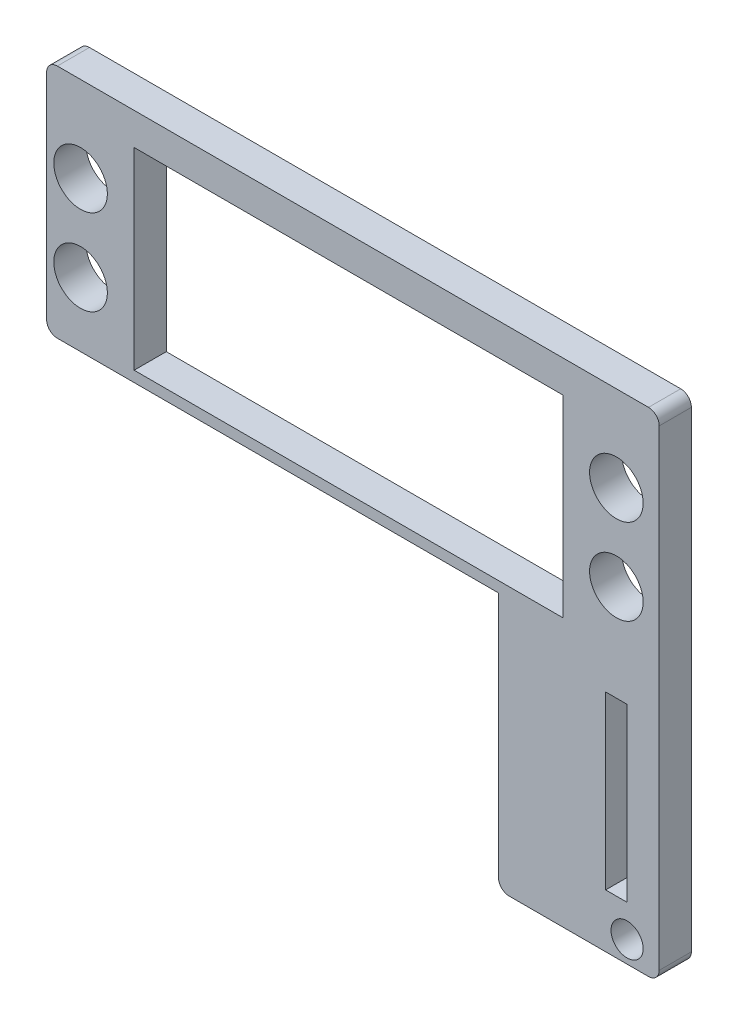
ISO-10303-21;
HEADER;
FILE_DESCRIPTION(('STEP AP214'),'2;1');
FILE_NAME('part.step','',(''),(''),'','','');
FILE_SCHEMA(('AUTOMOTIVE_DESIGN { 1 0 10303 214 1 1 1 1 }'));
ENDSEC;
DATA;
#1=APPLICATION_CONTEXT('core data for automotive mechanical design processes');
#2=APPLICATION_PROTOCOL_DEFINITION('international standard','automotive_design',2000,#1);
#3=PRODUCT_CONTEXT('',#1,'mechanical');
#4=PRODUCT('Part','Part','',(#3));
#5=PRODUCT_RELATED_PRODUCT_CATEGORY('part','',(#4));
#6=PRODUCT_DEFINITION_FORMATION('','',#4);
#7=PRODUCT_DEFINITION_CONTEXT('part definition',#1,'design');
#8=PRODUCT_DEFINITION('design','',#6,#7);
#9=PRODUCT_DEFINITION_SHAPE('','',#8);
#10=(LENGTH_UNIT() NAMED_UNIT(*) SI_UNIT(.MILLI.,.METRE.));
#11=(NAMED_UNIT(*) PLANE_ANGLE_UNIT() SI_UNIT($,.RADIAN.));
#12=(NAMED_UNIT(*) SI_UNIT($,.STERADIAN.) SOLID_ANGLE_UNIT());
#13=UNCERTAINTY_MEASURE_WITH_UNIT(LENGTH_MEASURE(1.E-05),#10,'distance_accuracy_value','');
#14=(GEOMETRIC_REPRESENTATION_CONTEXT(3) GLOBAL_UNCERTAINTY_ASSIGNED_CONTEXT((#13)) GLOBAL_UNIT_ASSIGNED_CONTEXT((#10,
#11,#12)) REPRESENTATION_CONTEXT('',''));
#15=CARTESIAN_POINT('',(0.,0.,0.));
#16=DIRECTION('',(0.,0.,1.));
#17=DIRECTION('',(1.,0.,0.));
#18=AXIS2_PLACEMENT_3D('',#15,#16,#17);
#19=CARTESIAN_POINT('',(1.,1.,0.));
#20=DIRECTION('',(0.,0.,1.));
#21=DIRECTION('',(1.,0.,0.));
#22=AXIS2_PLACEMENT_3D('',#19,#20,#21);
#23=CYLINDRICAL_SURFACE('',#22,1.);
#24=CARTESIAN_POINT('',(1.,1.,0.));
#25=DIRECTION('',(0.,0.,1.));
#26=DIRECTION('',(1.,0.,0.));
#27=AXIS2_PLACEMENT_3D('',#24,#25,#26);
#28=CIRCLE('',#27,1.);
#29=CARTESIAN_POINT('',(0.,1.,0.));
#30=VERTEX_POINT('',#29);
#31=CARTESIAN_POINT('',(1.,0.,0.));
#32=VERTEX_POINT('',#31);
#33=EDGE_CURVE('E303',#30,#32,#28,.T.);
#34=ORIENTED_EDGE('',*,*,#33,.T.);
#35=DIRECTION('',(0.,0.,-1.));
#36=VECTOR('',#35,1.);
#37=CARTESIAN_POINT('',(1.,0.,0.));
#38=LINE('',#37,#36);
#39=CARTESIAN_POINT('',(1.,0.,3.));
#40=VERTEX_POINT('',#39);
#41=EDGE_CURVE('E152',#40,#32,#38,.T.);
#42=ORIENTED_EDGE('',*,*,#41,.F.);
#43=CARTESIAN_POINT('',(1.,1.,3.));
#44=DIRECTION('',(0.,0.,1.));
#45=DIRECTION('',(1.,0.,0.));
#46=AXIS2_PLACEMENT_3D('',#43,#44,#45);
#47=CIRCLE('',#46,1.);
#48=CARTESIAN_POINT('',(0.,1.,3.));
#49=VERTEX_POINT('',#48);
#50=EDGE_CURVE('E20',#40,#49,#47,.F.);
#51=ORIENTED_EDGE('',*,*,#50,.T.);
#52=DIRECTION('',(0.,0.,1.));
#53=VECTOR('',#52,1.);
#54=CARTESIAN_POINT('',(0.,1.,0.));
#55=LINE('',#54,#53);
#56=EDGE_CURVE('E149',#30,#49,#55,.T.);
#57=ORIENTED_EDGE('',*,*,#56,.F.);
#58=EDGE_LOOP('',(#34,#42,#51,#57));
#59=FACE_BOUND('',#58,.T.);
#60=ADVANCED_FACE('F17',(#59),#23,.T.);
#61=CARTESIAN_POINT('',(14.,0.999999999999996,0.));
#62=DIRECTION('',(0.,0.,1.));
#63=DIRECTION('',(1.,0.,0.));
#64=AXIS2_PLACEMENT_3D('',#61,#62,#63);
#65=CYLINDRICAL_SURFACE('',#64,1.);
#66=CARTESIAN_POINT('',(14.,0.999999999999996,0.));
#67=DIRECTION('',(0.,0.,1.));
#68=DIRECTION('',(1.,0.,0.));
#69=AXIS2_PLACEMENT_3D('',#66,#67,#68);
#70=CIRCLE('',#69,1.);
#71=CARTESIAN_POINT('',(14.,0.,0.));
#72=VERTEX_POINT('',#71);
#73=CARTESIAN_POINT('',(15.,0.999999999999995,0.));
#74=VERTEX_POINT('',#73);
#75=EDGE_CURVE('E301',#72,#74,#70,.T.);
#76=ORIENTED_EDGE('',*,*,#75,.T.);
#77=DIRECTION('',(0.,0.,-1.));
#78=VECTOR('',#77,1.);
#79=CARTESIAN_POINT('',(15.,0.999999999999994,0.));
#80=LINE('',#79,#78);
#81=CARTESIAN_POINT('',(15.,0.999999999999995,3.));
#82=VERTEX_POINT('',#81);
#83=EDGE_CURVE('E238',#82,#74,#80,.T.);
#84=ORIENTED_EDGE('',*,*,#83,.F.);
#85=CARTESIAN_POINT('',(14.,0.999999999999996,3.));
#86=DIRECTION('',(0.,0.,1.));
#87=DIRECTION('',(1.,0.,0.));
#88=AXIS2_PLACEMENT_3D('',#85,#86,#87);
#89=CIRCLE('',#88,1.);
#90=CARTESIAN_POINT('',(14.,0.,3.));
#91=VERTEX_POINT('',#90);
#92=EDGE_CURVE('E154',#82,#91,#89,.F.);
#93=ORIENTED_EDGE('',*,*,#92,.T.);
#94=DIRECTION('',(0.,0.,-1.));
#95=VECTOR('',#94,1.);
#96=CARTESIAN_POINT('',(14.,0.,0.));
#97=LINE('',#96,#95);
#98=EDGE_CURVE('E246',#72,#91,#97,.F.);
#99=ORIENTED_EDGE('',*,*,#98,.F.);
#100=EDGE_LOOP('',(#76,#84,#93,#99));
#101=FACE_BOUND('',#100,.T.);
#102=ADVANCED_FACE('F312',(#101),#65,.T.);
#103=CARTESIAN_POINT('',(14.,45.,0.));
#104=DIRECTION('',(0.,0.,1.));
#105=DIRECTION('',(1.,0.,0.));
#106=AXIS2_PLACEMENT_3D('',#103,#104,#105);
#107=CYLINDRICAL_SURFACE('',#106,1.);
#108=CARTESIAN_POINT('',(14.,45.,0.));
#109=DIRECTION('',(0.,0.,1.));
#110=DIRECTION('',(1.,0.,0.));
#111=AXIS2_PLACEMENT_3D('',#108,#109,#110);
#112=CIRCLE('',#111,1.);
#113=CARTESIAN_POINT('',(15.,45.,0.));
#114=VERTEX_POINT('',#113);
#115=CARTESIAN_POINT('',(14.,46.,0.));
#116=VERTEX_POINT('',#115);
#117=EDGE_CURVE('E299',#114,#116,#112,.T.);
#118=ORIENTED_EDGE('',*,*,#117,.T.);
#119=DIRECTION('',(0.,0.,1.));
#120=VECTOR('',#119,1.);
#121=CARTESIAN_POINT('',(14.,46.,0.));
#122=LINE('',#121,#120);
#123=CARTESIAN_POINT('',(14.,46.,3.));
#124=VERTEX_POINT('',#123);
#125=EDGE_CURVE('E230',#124,#116,#122,.F.);
#126=ORIENTED_EDGE('',*,*,#125,.F.);
#127=CARTESIAN_POINT('',(14.,45.,3.));
#128=DIRECTION('',(0.,0.,1.));
#129=DIRECTION('',(1.,0.,0.));
#130=AXIS2_PLACEMENT_3D('',#127,#128,#129);
#131=CIRCLE('',#130,1.);
#132=CARTESIAN_POINT('',(15.,45.,3.));
#133=VERTEX_POINT('',#132);
#134=EDGE_CURVE('E309',#124,#133,#131,.F.);
#135=ORIENTED_EDGE('',*,*,#134,.T.);
#136=DIRECTION('',(0.,0.,-1.));
#137=VECTOR('',#136,1.);
#138=CARTESIAN_POINT('',(15.,45.,0.));
#139=LINE('',#138,#137);
#140=EDGE_CURVE('E241',#114,#133,#139,.F.);
#141=ORIENTED_EDGE('',*,*,#140,.F.);
#142=EDGE_LOOP('',(#118,#126,#135,#141));
#143=FACE_BOUND('',#142,.T.);
#144=ADVANCED_FACE('F443',(#143),#107,.T.);
#145=CARTESIAN_POINT('',(-41.1673508127766,45.,1.5));
#146=DIRECTION('',(0.,0.,1.));
#147=DIRECTION('',(1.,0.,0.));
#148=AXIS2_PLACEMENT_3D('',#145,#146,#147);
#149=CYLINDRICAL_SURFACE('',#148,1.);
#150=CARTESIAN_POINT('',(-41.1673508127766,45.,0.));
#151=DIRECTION('',(0.,0.,1.));
#152=DIRECTION('',(1.,0.,0.));
#153=AXIS2_PLACEMENT_3D('',#150,#151,#152);
#154=CIRCLE('',#153,1.);
#155=CARTESIAN_POINT('',(-41.1673508127766,46.,0.));
#156=VERTEX_POINT('',#155);
#157=CARTESIAN_POINT('',(-42.1673508127766,45.,0.));
#158=VERTEX_POINT('',#157);
#159=EDGE_CURVE('E297',#156,#158,#154,.T.);
#160=ORIENTED_EDGE('',*,*,#159,.T.);
#161=DIRECTION('',(0.,0.,-1.));
#162=VECTOR('',#161,1.);
#163=CARTESIAN_POINT('',(-42.1673508127766,45.,3.));
#164=LINE('',#163,#162);
#165=CARTESIAN_POINT('',(-42.1673508127766,45.,3.));
#166=VERTEX_POINT('',#165);
#167=EDGE_CURVE('E222',#158,#166,#164,.F.);
#168=ORIENTED_EDGE('',*,*,#167,.T.);
#169=CARTESIAN_POINT('',(-41.1673508127766,45.,3.));
#170=DIRECTION('',(0.,0.,1.));
#171=DIRECTION('',(1.,0.,0.));
#172=AXIS2_PLACEMENT_3D('',#169,#170,#171);
#173=CIRCLE('',#172,1.);
#174=CARTESIAN_POINT('',(-41.1673508127766,46.,3.));
#175=VERTEX_POINT('',#174);
#176=EDGE_CURVE('E307',#166,#175,#173,.F.);
#177=ORIENTED_EDGE('',*,*,#176,.T.);
#178=DIRECTION('',(0.,0.,1.));
#179=VECTOR('',#178,1.);
#180=CARTESIAN_POINT('',(-41.1673508127766,46.,0.));
#181=LINE('',#180,#179);
#182=EDGE_CURVE('E234',#156,#175,#181,.T.);
#183=ORIENTED_EDGE('',*,*,#182,.F.);
#184=EDGE_LOOP('',(#160,#168,#177,#183));
#185=FACE_BOUND('',#184,.T.);
#186=ADVANCED_FACE('F439',(#185),#149,.T.);
#187=CARTESIAN_POINT('',(-41.1673508127766,25.,1.5));
#188=DIRECTION('',(0.,0.,-1.));
#189=DIRECTION('',(-1.,0.,0.));
#190=AXIS2_PLACEMENT_3D('',#187,#188,#189);
#191=CYLINDRICAL_SURFACE('',#190,1.);
#192=CARTESIAN_POINT('',(-41.1673508127766,25.,3.));
#193=DIRECTION('',(0.,0.,-1.));
#194=DIRECTION('',(-1.,0.,0.));
#195=AXIS2_PLACEMENT_3D('',#192,#193,#194);
#196=CIRCLE('',#195,1.);
#197=CARTESIAN_POINT('',(-41.1673508127766,24.,3.));
#198=VERTEX_POINT('',#197);
#199=CARTESIAN_POINT('',(-42.1673508127766,25.,3.));
#200=VERTEX_POINT('',#199);
#201=EDGE_CURVE('E305',#198,#200,#196,.T.);
#202=ORIENTED_EDGE('',*,*,#201,.T.);
#203=DIRECTION('',(0.,0.,-1.));
#204=VECTOR('',#203,1.);
#205=CARTESIAN_POINT('',(-42.1673508127766,25.,3.));
#206=LINE('',#205,#204);
#207=CARTESIAN_POINT('',(-42.1673508127766,25.,0.));
#208=VERTEX_POINT('',#207);
#209=EDGE_CURVE('E225',#200,#208,#206,.T.);
#210=ORIENTED_EDGE('',*,*,#209,.T.);
#211=CARTESIAN_POINT('',(-41.1673508127766,25.,0.));
#212=DIRECTION('',(0.,0.,-1.));
#213=DIRECTION('',(-1.,0.,0.));
#214=AXIS2_PLACEMENT_3D('',#211,#212,#213);
#215=CIRCLE('',#214,1.);
#216=CARTESIAN_POINT('',(-41.1673508127766,24.,0.));
#217=VERTEX_POINT('',#216);
#218=EDGE_CURVE('E255',#208,#217,#215,.F.);
#219=ORIENTED_EDGE('',*,*,#218,.T.);
#220=DIRECTION('',(0.,0.,-1.));
#221=VECTOR('',#220,1.);
#222=CARTESIAN_POINT('',(-41.1673508127766,24.,0.));
#223=LINE('',#222,#221);
#224=EDGE_CURVE('E252',#198,#217,#223,.T.);
#225=ORIENTED_EDGE('',*,*,#224,.F.);
#226=EDGE_LOOP('',(#202,#210,#219,#225));
#227=FACE_BOUND('',#226,.T.);
#228=ADVANCED_FACE('F392',(#227),#191,.T.);
#229=CARTESIAN_POINT('',(-12.5357142857143,28.4642857142857,0.));
#230=DIRECTION('',(0.,0.,1.));
#231=DIRECTION('',(1.,0.,0.));
#232=AXIS2_PLACEMENT_3D('',#229,#230,#231);
#233=PLANE('',#232);
#234=CARTESIAN_POINT('',(12.,2.,0.));
#235=DIRECTION('',(0.,0.,-1.));
#236=DIRECTION('',(-1.,0.,0.));
#237=AXIS2_PLACEMENT_3D('',#234,#235,#236);
#238=CIRCLE('',#237,1.5);
#239=CARTESIAN_POINT('',(10.5,2.,0.));
#240=VERTEX_POINT('',#239);
#241=EDGE_CURVE('E174',#240,#240,#238,.F.);
#242=ORIENTED_EDGE('',*,*,#241,.T.);
#243=EDGE_LOOP('',(#242));
#244=FACE_BOUND('',#243,.T.);
#245=DIRECTION('',(0.,1.,0.));
#246=VECTOR('',#245,1.);
#247=CARTESIAN_POINT('',(10.,21.,0.));
#248=LINE('',#247,#246);
#249=CARTESIAN_POINT('',(10.,21.,0.));
#250=VERTEX_POINT('',#249);
#251=CARTESIAN_POINT('',(10.,5.,0.));
#252=VERTEX_POINT('',#251);
#253=EDGE_CURVE('E182',#250,#252,#248,.F.);
#254=ORIENTED_EDGE('',*,*,#253,.T.);
#255=DIRECTION('',(1.,0.,0.));
#256=VECTOR('',#255,1.);
#257=CARTESIAN_POINT('',(10.,5.,0.));
#258=LINE('',#257,#256);
#259=CARTESIAN_POINT('',(12.,5.,0.));
#260=VERTEX_POINT('',#259);
#261=EDGE_CURVE('E189',#252,#260,#258,.T.);
#262=ORIENTED_EDGE('',*,*,#261,.T.);
#263=DIRECTION('',(0.,1.,0.));
#264=VECTOR('',#263,1.);
#265=CARTESIAN_POINT('',(12.,5.,0.));
#266=LINE('',#265,#264);
#267=CARTESIAN_POINT('',(12.,21.,0.));
#268=VERTEX_POINT('',#267);
#269=EDGE_CURVE('E194',#260,#268,#266,.T.);
#270=ORIENTED_EDGE('',*,*,#269,.T.);
#271=DIRECTION('',(1.,0.,0.));
#272=VECTOR('',#271,1.);
#273=CARTESIAN_POINT('',(12.,21.,0.));
#274=LINE('',#273,#272);
#275=EDGE_CURVE('E199',#268,#250,#274,.F.);
#276=ORIENTED_EDGE('',*,*,#275,.T.);
#277=EDGE_LOOP('',(#254,#262,#270,#276));
#278=FACE_BOUND('',#277,.T.);
#279=DIRECTION('',(1.,0.,0.));
#280=VECTOR('',#279,1.);
#281=CARTESIAN_POINT('',(5.99999999999939,43.0000000000001,0.));
#282=LINE('',#281,#280);
#283=CARTESIAN_POINT('',(5.9999999999997,42.9999999999997,0.));
#284=VERTEX_POINT('',#283);
#285=CARTESIAN_POINT('',(-34.0000000000033,42.999999999999,0.));
#286=VERTEX_POINT('',#285);
#287=EDGE_CURVE('E201',#284,#286,#282,.F.);
#288=ORIENTED_EDGE('',*,*,#287,.T.);
#289=DIRECTION('',(0.,1.,0.));
#290=VECTOR('',#289,1.);
#291=CARTESIAN_POINT('',(-34.0000000000062,25.9999999999999,0.));
#292=LINE('',#291,#290);
#293=CARTESIAN_POINT('',(-34.0000000000015,24.999999999999,0.));
#294=VERTEX_POINT('',#293);
#295=EDGE_CURVE('E209',#286,#294,#292,.F.);
#296=ORIENTED_EDGE('',*,*,#295,.T.);
#297=DIRECTION('',(1.,0.,0.));
#298=VECTOR('',#297,1.);
#299=CARTESIAN_POINT('',(-34.,24.9999999999986,0.));
#300=LINE('',#299,#298);
#301=CARTESIAN_POINT('',(5.99999999999986,24.9999999999997,0.));
#302=VERTEX_POINT('',#301);
#303=EDGE_CURVE('E214',#294,#302,#300,.T.);
#304=ORIENTED_EDGE('',*,*,#303,.T.);
#305=DIRECTION('',(0.,1.,0.));
#306=VECTOR('',#305,1.);
#307=CARTESIAN_POINT('',(6.00000000000001,26.0000000000001,0.));
#308=LINE('',#307,#306);
#309=EDGE_CURVE('E219',#302,#284,#308,.T.);
#310=ORIENTED_EDGE('',*,*,#309,.T.);
#311=EDGE_LOOP('',(#288,#296,#304,#310));
#312=FACE_BOUND('',#311,.T.);
#313=CARTESIAN_POINT('',(11.,38.,0.));
#314=DIRECTION('',(0.,0.,-1.));
#315=DIRECTION('',(-1.,0.,0.));
#316=AXIS2_PLACEMENT_3D('',#313,#314,#315);
#317=CIRCLE('',#316,2.5);
#318=CARTESIAN_POINT('',(8.49999999999996,38.,0.));
#319=VERTEX_POINT('',#318);
#320=EDGE_CURVE('E221',#319,#319,#317,.F.);
#321=ORIENTED_EDGE('',*,*,#320,.T.);
#322=EDGE_LOOP('',(#321));
#323=FACE_BOUND('',#322,.T.);
#324=CARTESIAN_POINT('',(-39.,38.0000000000001,0.));
#325=DIRECTION('',(0.,0.,-1.));
#326=DIRECTION('',(-1.,0.,0.));
#327=AXIS2_PLACEMENT_3D('',#324,#325,#326);
#328=CIRCLE('',#327,2.5);
#329=CARTESIAN_POINT('',(-41.5,38.0000000000001,0.));
#330=VERTEX_POINT('',#329);
#331=EDGE_CURVE('E288',#330,#330,#328,.F.);
#332=ORIENTED_EDGE('',*,*,#331,.T.);
#333=EDGE_LOOP('',(#332));
#334=FACE_BOUND('',#333,.T.);
#335=CARTESIAN_POINT('',(11.,30.,0.));
#336=DIRECTION('',(0.,0.,-1.));
#337=DIRECTION('',(-1.,0.,0.));
#338=AXIS2_PLACEMENT_3D('',#335,#336,#337);
#339=CIRCLE('',#338,2.5);
#340=CARTESIAN_POINT('',(8.49999999999999,30.,0.));
#341=VERTEX_POINT('',#340);
#342=EDGE_CURVE('E291',#341,#341,#339,.F.);
#343=ORIENTED_EDGE('',*,*,#342,.T.);
#344=EDGE_LOOP('',(#343));
#345=FACE_BOUND('',#344,.T.);
#346=CARTESIAN_POINT('',(-39.,30.,0.));
#347=DIRECTION('',(0.,0.,-1.));
#348=DIRECTION('',(-1.,0.,0.));
#349=AXIS2_PLACEMENT_3D('',#346,#347,#348);
#350=CIRCLE('',#349,2.5);
#351=CARTESIAN_POINT('',(-41.5,30.,0.));
#352=VERTEX_POINT('',#351);
#353=EDGE_CURVE('E229',#352,#352,#350,.F.);
#354=ORIENTED_EDGE('',*,*,#353,.T.);
#355=EDGE_LOOP('',(#354));
#356=FACE_BOUND('',#355,.T.);
#357=DIRECTION('',(0.,1.,0.));
#358=VECTOR('',#357,1.);
#359=CARTESIAN_POINT('',(-42.1673508127766,24.,0.));
#360=LINE('',#359,#358);
#361=EDGE_CURVE('E226',#208,#158,#360,.T.);
#362=ORIENTED_EDGE('',*,*,#361,.T.);
#363=ORIENTED_EDGE('',*,*,#159,.F.);
#364=DIRECTION('',(1.,0.,0.));
#365=VECTOR('',#364,1.);
#366=CARTESIAN_POINT('',(-20.,46.,0.));
#367=LINE('',#366,#365);
#368=EDGE_CURVE('E233',#116,#156,#367,.F.);
#369=ORIENTED_EDGE('',*,*,#368,.F.);
#370=ORIENTED_EDGE('',*,*,#117,.F.);
#371=DIRECTION('',(0.,1.,0.));
#372=VECTOR('',#371,1.);
#373=CARTESIAN_POINT('',(15.,46.,0.));
#374=LINE('',#373,#372);
#375=EDGE_CURVE('E237',#74,#114,#374,.T.);
#376=ORIENTED_EDGE('',*,*,#375,.F.);
#377=ORIENTED_EDGE('',*,*,#75,.F.);
#378=DIRECTION('',(1.,0.,0.));
#379=VECTOR('',#378,1.);
#380=CARTESIAN_POINT('',(15.,0.,0.));
#381=LINE('',#380,#379);
#382=EDGE_CURVE('E244',#32,#72,#381,.T.);
#383=ORIENTED_EDGE('',*,*,#382,.F.);
#384=ORIENTED_EDGE('',*,*,#33,.F.);
#385=DIRECTION('',(0.,1.,0.));
#386=VECTOR('',#385,1.);
#387=CARTESIAN_POINT('',(0.,0.,0.));
#388=LINE('',#387,#386);
#389=CARTESIAN_POINT('',(0.,24.,0.));
#390=VERTEX_POINT('',#389);
#391=EDGE_CURVE('E163',#390,#30,#388,.F.);
#392=ORIENTED_EDGE('',*,*,#391,.F.);
#393=DIRECTION('',(1.,0.,0.));
#394=VECTOR('',#393,1.);
#395=CARTESIAN_POINT('',(0.,24.,0.));
#396=LINE('',#395,#394);
#397=EDGE_CURVE('E165',#217,#390,#396,.T.);
#398=ORIENTED_EDGE('',*,*,#397,.F.);
#399=ORIENTED_EDGE('',*,*,#218,.F.);
#400=EDGE_LOOP('',(#362,#363,#369,#370,#376,#377,#383,#384,#392,#398,#399));
#401=FACE_BOUND('',#400,.T.);
#402=ADVANCED_FACE('F320',(#244,#278,#312,#323,#334,#345,#356,#401),#233,.F.);
#403=CARTESIAN_POINT('',(0.,24.,0.));
#404=DIRECTION('',(0.,-1.,0.));
#405=DIRECTION('',(0.,0.,-1.));
#406=AXIS2_PLACEMENT_3D('',#403,#404,#405);
#407=PLANE('',#406);
#408=DIRECTION('',(0.,0.,1.));
#409=VECTOR('',#408,1.);
#410=CARTESIAN_POINT('',(0.,24.,0.));
#411=LINE('',#410,#409);
#412=CARTESIAN_POINT('',(0.,24.,3.));
#413=VERTEX_POINT('',#412);
#414=EDGE_CURVE('E164',#413,#390,#411,.F.);
#415=ORIENTED_EDGE('',*,*,#414,.F.);
#416=DIRECTION('',(1.,0.,0.));
#417=VECTOR('',#416,1.);
#418=CARTESIAN_POINT('',(-12.5357142857143,24.,3.));
#419=LINE('',#418,#417);
#420=EDGE_CURVE('E169',#198,#413,#419,.T.);
#421=ORIENTED_EDGE('',*,*,#420,.F.);
#422=ORIENTED_EDGE('',*,*,#224,.T.);
#423=ORIENTED_EDGE('',*,*,#397,.T.);
#424=EDGE_LOOP('',(#415,#421,#422,#423));
#425=FACE_BOUND('',#424,.T.);
#426=ADVANCED_FACE('F391',(#425),#407,.T.);
#427=CARTESIAN_POINT('',(0.,0.,0.));
#428=DIRECTION('',(-1.,0.,0.));
#429=DIRECTION('',(0.,0.,1.));
#430=AXIS2_PLACEMENT_3D('',#427,#428,#429);
#431=PLANE('',#430);
#432=ORIENTED_EDGE('',*,*,#414,.T.);
#433=ORIENTED_EDGE('',*,*,#391,.T.);
#434=ORIENTED_EDGE('',*,*,#56,.T.);
#435=DIRECTION('',(0.,1.,0.));
#436=VECTOR('',#435,1.);
#437=CARTESIAN_POINT('',(0.,28.4642857142857,3.));
#438=LINE('',#437,#436);
#439=EDGE_CURVE('E160',#413,#49,#438,.F.);
#440=ORIENTED_EDGE('',*,*,#439,.F.);
#441=EDGE_LOOP('',(#432,#433,#434,#440));
#442=FACE_BOUND('',#441,.T.);
#443=ADVANCED_FACE('F159',(#442),#431,.T.);
#444=CARTESIAN_POINT('',(15.,0.,0.));
#445=DIRECTION('',(0.,-1.,0.));
#446=DIRECTION('',(0.,0.,-1.));
#447=AXIS2_PLACEMENT_3D('',#444,#445,#446);
#448=PLANE('',#447);
#449=ORIENTED_EDGE('',*,*,#41,.T.);
#450=ORIENTED_EDGE('',*,*,#382,.T.);
#451=ORIENTED_EDGE('',*,*,#98,.T.);
#452=DIRECTION('',(1.,0.,0.));
#453=VECTOR('',#452,1.);
#454=CARTESIAN_POINT('',(-12.5357142857143,0.,3.));
#455=LINE('',#454,#453);
#456=EDGE_CURVE('E170',#40,#91,#455,.T.);
#457=ORIENTED_EDGE('',*,*,#456,.F.);
#458=EDGE_LOOP('',(#449,#450,#451,#457));
#459=FACE_BOUND('',#458,.T.);
#460=ADVANCED_FACE('F317',(#459),#448,.T.);
#461=CARTESIAN_POINT('',(15.,46.,0.));
#462=DIRECTION('',(1.,0.,0.));
#463=DIRECTION('',(0.,0.,-1.));
#464=AXIS2_PLACEMENT_3D('',#461,#462,#463);
#465=PLANE('',#464);
#466=ORIENTED_EDGE('',*,*,#83,.T.);
#467=ORIENTED_EDGE('',*,*,#375,.T.);
#468=ORIENTED_EDGE('',*,*,#140,.T.);
#469=DIRECTION('',(0.,1.,0.));
#470=VECTOR('',#469,1.);
#471=CARTESIAN_POINT('',(15.,28.4642857142857,3.));
#472=LINE('',#471,#470);
#473=EDGE_CURVE('E172',#82,#133,#472,.T.);
#474=ORIENTED_EDGE('',*,*,#473,.F.);
#475=EDGE_LOOP('',(#466,#467,#468,#474));
#476=FACE_BOUND('',#475,.T.);
#477=ADVANCED_FACE('F325',(#476),#465,.T.);
#478=CARTESIAN_POINT('',(-20.,46.,0.));
#479=DIRECTION('',(0.,1.,0.));
#480=DIRECTION('',(0.,0.,1.));
#481=AXIS2_PLACEMENT_3D('',#478,#479,#480);
#482=PLANE('',#481);
#483=ORIENTED_EDGE('',*,*,#125,.T.);
#484=ORIENTED_EDGE('',*,*,#368,.T.);
#485=ORIENTED_EDGE('',*,*,#182,.T.);
#486=DIRECTION('',(1.,0.,0.));
#487=VECTOR('',#486,1.);
#488=CARTESIAN_POINT('',(-12.5357142857143,46.,3.));
#489=LINE('',#488,#487);
#490=EDGE_CURVE('E326',#124,#175,#489,.F.);
#491=ORIENTED_EDGE('',*,*,#490,.F.);
#492=EDGE_LOOP('',(#483,#484,#485,#491));
#493=FACE_BOUND('',#492,.T.);
#494=ADVANCED_FACE('F419',(#493),#482,.T.);
#495=CARTESIAN_POINT('',(-42.1673508127766,24.,3.));
#496=DIRECTION('',(1.,0.,0.));
#497=DIRECTION('',(0.,0.,-1.));
#498=AXIS2_PLACEMENT_3D('',#495,#496,#497);
#499=PLANE('',#498);
#500=DIRECTION('',(0.,1.,0.));
#501=VECTOR('',#500,1.);
#502=CARTESIAN_POINT('',(-42.1673508127766,28.4642857142857,3.));
#503=LINE('',#502,#501);
#504=EDGE_CURVE('E283',#166,#200,#503,.F.);
#505=ORIENTED_EDGE('',*,*,#504,.F.);
#506=ORIENTED_EDGE('',*,*,#167,.F.);
#507=ORIENTED_EDGE('',*,*,#361,.F.);
#508=ORIENTED_EDGE('',*,*,#209,.F.);
#509=EDGE_LOOP('',(#505,#506,#507,#508));
#510=FACE_BOUND('',#509,.T.);
#511=ADVANCED_FACE('F409',(#510),#499,.F.);
#512=CARTESIAN_POINT('',(-39.,30.,3.));
#513=DIRECTION('',(0.,0.,-1.));
#514=DIRECTION('',(-1.,0.,0.));
#515=AXIS2_PLACEMENT_3D('',#512,#513,#514);
#516=CYLINDRICAL_SURFACE('',#515,2.5);
#517=CARTESIAN_POINT('',(-39.,30.,3.));
#518=DIRECTION('',(0.,0.,-1.));
#519=DIRECTION('',(-1.,0.,0.));
#520=AXIS2_PLACEMENT_3D('',#517,#518,#519);
#521=CIRCLE('',#520,2.5);
#522=CARTESIAN_POINT('',(-41.5,30.,3.));
#523=VERTEX_POINT('',#522);
#524=EDGE_CURVE('E280',#523,#523,#521,.T.);
#525=ORIENTED_EDGE('',*,*,#524,.F.);
#526=EDGE_LOOP('',(#525));
#527=FACE_BOUND('',#526,.T.);
#528=ORIENTED_EDGE('',*,*,#353,.F.);
#529=EDGE_LOOP('',(#528));
#530=FACE_BOUND('',#529,.T.);
#531=ADVANCED_FACE('F406',(#527,#530),#516,.F.);
#532=CARTESIAN_POINT('',(11.,30.,3.));
#533=DIRECTION('',(0.,0.,-1.));
#534=DIRECTION('',(-1.,0.,0.));
#535=AXIS2_PLACEMENT_3D('',#532,#533,#534);
#536=CYLINDRICAL_SURFACE('',#535,2.5);
#537=CARTESIAN_POINT('',(11.,30.,3.));
#538=DIRECTION('',(0.,0.,-1.));
#539=DIRECTION('',(-1.,0.,0.));
#540=AXIS2_PLACEMENT_3D('',#537,#538,#539);
#541=CIRCLE('',#540,2.5);
#542=CARTESIAN_POINT('',(8.49999999999999,30.,3.));
#543=VERTEX_POINT('',#542);
#544=EDGE_CURVE('E277',#543,#543,#541,.T.);
#545=ORIENTED_EDGE('',*,*,#544,.F.);
#546=EDGE_LOOP('',(#545));
#547=FACE_BOUND('',#546,.T.);
#548=ORIENTED_EDGE('',*,*,#342,.F.);
#549=EDGE_LOOP('',(#548));
#550=FACE_BOUND('',#549,.T.);
#551=ADVANCED_FACE('F408',(#547,#550),#536,.F.);
#552=CARTESIAN_POINT('',(-39.,38.0000000000001,3.));
#553=DIRECTION('',(0.,0.,-1.));
#554=DIRECTION('',(-1.,0.,0.));
#555=AXIS2_PLACEMENT_3D('',#552,#553,#554);
#556=CYLINDRICAL_SURFACE('',#555,2.5);
#557=CARTESIAN_POINT('',(-39.,38.0000000000001,3.));
#558=DIRECTION('',(0.,0.,-1.));
#559=DIRECTION('',(-1.,0.,0.));
#560=AXIS2_PLACEMENT_3D('',#557,#558,#559);
#561=CIRCLE('',#560,2.5);
#562=CARTESIAN_POINT('',(-41.5,38.0000000000001,3.));
#563=VERTEX_POINT('',#562);
#564=EDGE_CURVE('E274',#563,#563,#561,.T.);
#565=ORIENTED_EDGE('',*,*,#564,.F.);
#566=EDGE_LOOP('',(#565));
#567=FACE_BOUND('',#566,.T.);
#568=ORIENTED_EDGE('',*,*,#331,.F.);
#569=EDGE_LOOP('',(#568));
#570=FACE_BOUND('',#569,.T.);
#571=ADVANCED_FACE('F416',(#567,#570),#556,.F.);
#572=CARTESIAN_POINT('',(11.,38.,3.));
#573=DIRECTION('',(0.,0.,-1.));
#574=DIRECTION('',(-1.,0.,0.));
#575=AXIS2_PLACEMENT_3D('',#572,#573,#574);
#576=CYLINDRICAL_SURFACE('',#575,2.5);
#577=CARTESIAN_POINT('',(11.,38.,3.));
#578=DIRECTION('',(0.,0.,-1.));
#579=DIRECTION('',(-1.,0.,0.));
#580=AXIS2_PLACEMENT_3D('',#577,#578,#579);
#581=CIRCLE('',#580,2.5);
#582=CARTESIAN_POINT('',(8.49999999999996,38.,3.));
#583=VERTEX_POINT('',#582);
#584=EDGE_CURVE('E270',#583,#583,#581,.T.);
#585=ORIENTED_EDGE('',*,*,#584,.F.);
#586=EDGE_LOOP('',(#585));
#587=FACE_BOUND('',#586,.T.);
#588=ORIENTED_EDGE('',*,*,#320,.F.);
#589=EDGE_LOOP('',(#588));
#590=FACE_BOUND('',#589,.T.);
#591=ADVANCED_FACE('F541',(#587,#590),#576,.F.);
#592=CARTESIAN_POINT('',(6.00000000000001,26.0000000000001,3.));
#593=DIRECTION('',(1.,0.,0.));
#594=DIRECTION('',(0.,0.,-1.));
#595=AXIS2_PLACEMENT_3D('',#592,#593,#594);
#596=PLANE('',#595);
#597=DIRECTION('',(0.,0.,-1.));
#598=VECTOR('',#597,1.);
#599=CARTESIAN_POINT('',(6.00000000000005,24.9999999999986,3.));
#600=LINE('',#599,#598);
#601=CARTESIAN_POINT('',(5.99999999999986,24.9999999999997,3.));
#602=VERTEX_POINT('',#601);
#603=EDGE_CURVE('E217',#302,#602,#600,.F.);
#604=ORIENTED_EDGE('',*,*,#603,.T.);
#605=DIRECTION('',(0.,1.,0.));
#606=VECTOR('',#605,1.);
#607=CARTESIAN_POINT('',(5.99999999999939,28.4642857142857,3.));
#608=LINE('',#607,#606);
#609=CARTESIAN_POINT('',(5.9999999999997,42.9999999999997,3.));
#610=VERTEX_POINT('',#609);
#611=EDGE_CURVE('E273',#610,#602,#608,.F.);
#612=ORIENTED_EDGE('',*,*,#611,.F.);
#613=DIRECTION('',(0.,0.,1.));
#614=VECTOR('',#613,1.);
#615=CARTESIAN_POINT('',(5.99999999999939,43.0000000000001,3.));
#616=LINE('',#615,#614);
#617=EDGE_CURVE('E204',#610,#284,#616,.F.);
#618=ORIENTED_EDGE('',*,*,#617,.T.);
#619=ORIENTED_EDGE('',*,*,#309,.F.);
#620=EDGE_LOOP('',(#604,#612,#618,#619));
#621=FACE_BOUND('',#620,.T.);
#622=ADVANCED_FACE('F550',(#621),#596,.F.);
#623=CARTESIAN_POINT('',(-34.,24.9999999999986,3.));
#624=DIRECTION('',(0.,-1.,0.));
#625=DIRECTION('',(0.,0.,-1.));
#626=AXIS2_PLACEMENT_3D('',#623,#624,#625);
#627=PLANE('',#626);
#628=DIRECTION('',(0.,0.,1.));
#629=VECTOR('',#628,1.);
#630=CARTESIAN_POINT('',(-34.0000000000062,24.9999999999986,3.));
#631=LINE('',#630,#629);
#632=CARTESIAN_POINT('',(-34.0000000000015,24.999999999999,3.));
#633=VERTEX_POINT('',#632);
#634=EDGE_CURVE('E212',#294,#633,#631,.T.);
#635=ORIENTED_EDGE('',*,*,#634,.T.);
#636=DIRECTION('',(1.,0.,0.));
#637=VECTOR('',#636,1.);
#638=CARTESIAN_POINT('',(-12.5357142857143,25.0000000000001,3.));
#639=LINE('',#638,#637);
#640=EDGE_CURVE('E334',#602,#633,#639,.F.);
#641=ORIENTED_EDGE('',*,*,#640,.F.);
#642=ORIENTED_EDGE('',*,*,#603,.F.);
#643=ORIENTED_EDGE('',*,*,#303,.F.);
#644=EDGE_LOOP('',(#635,#641,#642,#643));
#645=FACE_BOUND('',#644,.T.);
#646=ADVANCED_FACE('F560',(#645),#627,.F.);
#647=CARTESIAN_POINT('',(-34.0000000000062,25.9999999999999,3.));
#648=DIRECTION('',(-1.,0.,0.));
#649=DIRECTION('',(0.,0.,1.));
#650=AXIS2_PLACEMENT_3D('',#647,#648,#649);
#651=PLANE('',#650);
#652=DIRECTION('',(0.,0.,1.));
#653=VECTOR('',#652,1.);
#654=CARTESIAN_POINT('',(-34.0000000000006,43.0000000000001,3.));
#655=LINE('',#654,#653);
#656=CARTESIAN_POINT('',(-34.0000000000033,42.999999999999,3.));
#657=VERTEX_POINT('',#656);
#658=EDGE_CURVE('E207',#286,#657,#655,.T.);
#659=ORIENTED_EDGE('',*,*,#658,.T.);
#660=DIRECTION('',(0.,1.,0.));
#661=VECTOR('',#660,1.);
#662=CARTESIAN_POINT('',(-34.,28.4642857142857,3.));
#663=LINE('',#662,#661);
#664=EDGE_CURVE('E337',#633,#657,#663,.T.);
#665=ORIENTED_EDGE('',*,*,#664,.F.);
#666=ORIENTED_EDGE('',*,*,#634,.F.);
#667=ORIENTED_EDGE('',*,*,#295,.F.);
#668=EDGE_LOOP('',(#659,#665,#666,#667));
#669=FACE_BOUND('',#668,.T.);
#670=ADVANCED_FACE('F570',(#669),#651,.F.);
#671=CARTESIAN_POINT('',(5.99999999999939,43.0000000000001,3.));
#672=DIRECTION('',(0.,1.,0.));
#673=DIRECTION('',(0.,0.,1.));
#674=AXIS2_PLACEMENT_3D('',#671,#672,#673);
#675=PLANE('',#674);
#676=ORIENTED_EDGE('',*,*,#617,.F.);
#677=DIRECTION('',(1.,0.,0.));
#678=VECTOR('',#677,1.);
#679=CARTESIAN_POINT('',(-12.5357142857143,42.9999999999986,3.));
#680=LINE('',#679,#678);
#681=EDGE_CURVE('E340',#657,#610,#680,.T.);
#682=ORIENTED_EDGE('',*,*,#681,.F.);
#683=ORIENTED_EDGE('',*,*,#658,.F.);
#684=ORIENTED_EDGE('',*,*,#287,.F.);
#685=EDGE_LOOP('',(#676,#682,#683,#684));
#686=FACE_BOUND('',#685,.T.);
#687=ADVANCED_FACE('F580',(#686),#675,.F.);
#688=CARTESIAN_POINT('',(12.,21.,3.));
#689=DIRECTION('',(0.,1.,0.));
#690=DIRECTION('',(0.,0.,1.));
#691=AXIS2_PLACEMENT_3D('',#688,#689,#690);
#692=PLANE('',#691);
#693=DIRECTION('',(0.,0.,-1.));
#694=VECTOR('',#693,1.);
#695=CARTESIAN_POINT('',(12.,21.,3.));
#696=LINE('',#695,#694);
#697=CARTESIAN_POINT('',(12.,21.,3.));
#698=VERTEX_POINT('',#697);
#699=EDGE_CURVE('E197',#268,#698,#696,.F.);
#700=ORIENTED_EDGE('',*,*,#699,.T.);
#701=DIRECTION('',(1.,0.,0.));
#702=VECTOR('',#701,1.);
#703=CARTESIAN_POINT('',(-12.5357142857143,21.,3.));
#704=LINE('',#703,#702);
#705=CARTESIAN_POINT('',(10.,21.,3.));
#706=VERTEX_POINT('',#705);
#707=EDGE_CURVE('E343',#706,#698,#704,.T.);
#708=ORIENTED_EDGE('',*,*,#707,.F.);
#709=DIRECTION('',(0.,0.,1.));
#710=VECTOR('',#709,1.);
#711=CARTESIAN_POINT('',(10.,21.,3.));
#712=LINE('',#711,#710);
#713=EDGE_CURVE('E185',#706,#250,#712,.F.);
#714=ORIENTED_EDGE('',*,*,#713,.T.);
#715=ORIENTED_EDGE('',*,*,#275,.F.);
#716=EDGE_LOOP('',(#700,#708,#714,#715));
#717=FACE_BOUND('',#716,.T.);
#718=ADVANCED_FACE('F360',(#717),#692,.F.);
#719=CARTESIAN_POINT('',(12.,5.,3.));
#720=DIRECTION('',(1.,0.,0.));
#721=DIRECTION('',(0.,0.,-1.));
#722=AXIS2_PLACEMENT_3D('',#719,#720,#721);
#723=PLANE('',#722);
#724=DIRECTION('',(0.,0.,-1.));
#725=VECTOR('',#724,1.);
#726=CARTESIAN_POINT('',(12.,5.,3.));
#727=LINE('',#726,#725);
#728=CARTESIAN_POINT('',(12.,5.,3.));
#729=VERTEX_POINT('',#728);
#730=EDGE_CURVE('E192',#260,#729,#727,.F.);
#731=ORIENTED_EDGE('',*,*,#730,.T.);
#732=DIRECTION('',(0.,1.,0.));
#733=VECTOR('',#732,1.);
#734=CARTESIAN_POINT('',(12.,28.4642857142857,3.));
#735=LINE('',#734,#733);
#736=EDGE_CURVE('E346',#698,#729,#735,.F.);
#737=ORIENTED_EDGE('',*,*,#736,.F.);
#738=ORIENTED_EDGE('',*,*,#699,.F.);
#739=ORIENTED_EDGE('',*,*,#269,.F.);
#740=EDGE_LOOP('',(#731,#737,#738,#739));
#741=FACE_BOUND('',#740,.T.);
#742=ADVANCED_FACE('F364',(#741),#723,.F.);
#743=CARTESIAN_POINT('',(10.,5.,3.));
#744=DIRECTION('',(0.,-1.,0.));
#745=DIRECTION('',(0.,0.,-1.));
#746=AXIS2_PLACEMENT_3D('',#743,#744,#745);
#747=PLANE('',#746);
#748=DIRECTION('',(0.,0.,1.));
#749=VECTOR('',#748,1.);
#750=CARTESIAN_POINT('',(10.,5.,3.));
#751=LINE('',#750,#749);
#752=CARTESIAN_POINT('',(10.,5.,3.));
#753=VERTEX_POINT('',#752);
#754=EDGE_CURVE('E35',#252,#753,#751,.T.);
#755=ORIENTED_EDGE('',*,*,#754,.T.);
#756=DIRECTION('',(1.,0.,0.));
#757=VECTOR('',#756,1.);
#758=CARTESIAN_POINT('',(-12.5357142857143,5.,3.));
#759=LINE('',#758,#757);
#760=EDGE_CURVE('E349',#729,#753,#759,.F.);
#761=ORIENTED_EDGE('',*,*,#760,.F.);
#762=ORIENTED_EDGE('',*,*,#730,.F.);
#763=ORIENTED_EDGE('',*,*,#261,.F.);
#764=EDGE_LOOP('',(#755,#761,#762,#763));
#765=FACE_BOUND('',#764,.T.);
#766=ADVANCED_FACE('F366',(#765),#747,.F.);
#767=CARTESIAN_POINT('',(10.,21.,3.));
#768=DIRECTION('',(-1.,0.,0.));
#769=DIRECTION('',(0.,0.,1.));
#770=AXIS2_PLACEMENT_3D('',#767,#768,#769);
#771=PLANE('',#770);
#772=ORIENTED_EDGE('',*,*,#713,.F.);
#773=DIRECTION('',(0.,1.,0.));
#774=VECTOR('',#773,1.);
#775=CARTESIAN_POINT('',(10.,28.4642857142857,3.));
#776=LINE('',#775,#774);
#777=EDGE_CURVE('E26',#753,#706,#776,.T.);
#778=ORIENTED_EDGE('',*,*,#777,.F.);
#779=ORIENTED_EDGE('',*,*,#754,.F.);
#780=ORIENTED_EDGE('',*,*,#253,.F.);
#781=EDGE_LOOP('',(#772,#778,#779,#780));
#782=FACE_BOUND('',#781,.T.);
#783=ADVANCED_FACE('F357',(#782),#771,.F.);
#784=CARTESIAN_POINT('',(12.,2.,3.));
#785=DIRECTION('',(0.,0.,-1.));
#786=DIRECTION('',(-1.,0.,0.));
#787=AXIS2_PLACEMENT_3D('',#784,#785,#786);
#788=CYLINDRICAL_SURFACE('',#787,1.5);
#789=CARTESIAN_POINT('',(12.,2.,3.));
#790=DIRECTION('',(0.,0.,-1.));
#791=DIRECTION('',(-1.,0.,0.));
#792=AXIS2_PLACEMENT_3D('',#789,#790,#791);
#793=CIRCLE('',#792,1.5);
#794=CARTESIAN_POINT('',(10.5,2.,3.));
#795=VERTEX_POINT('',#794);
#796=EDGE_CURVE('E11',#795,#795,#793,.T.);
#797=ORIENTED_EDGE('',*,*,#796,.F.);
#798=EDGE_LOOP('',(#797));
#799=FACE_BOUND('',#798,.T.);
#800=ORIENTED_EDGE('',*,*,#241,.F.);
#801=EDGE_LOOP('',(#800));
#802=FACE_BOUND('',#801,.T.);
#803=ADVANCED_FACE('F374',(#799,#802),#788,.F.);
#804=CARTESIAN_POINT('',(-12.5357142857143,28.4642857142857,3.));
#805=DIRECTION('',(0.,0.,1.));
#806=DIRECTION('',(1.,0.,0.));
#807=AXIS2_PLACEMENT_3D('',#804,#805,#806);
#808=PLANE('',#807);
#809=ORIENTED_EDGE('',*,*,#796,.T.);
#810=EDGE_LOOP('',(#809));
#811=FACE_BOUND('',#810,.T.);
#812=ORIENTED_EDGE('',*,*,#760,.T.);
#813=ORIENTED_EDGE('',*,*,#777,.T.);
#814=ORIENTED_EDGE('',*,*,#707,.T.);
#815=ORIENTED_EDGE('',*,*,#736,.T.);
#816=EDGE_LOOP('',(#812,#813,#814,#815));
#817=FACE_BOUND('',#816,.T.);
#818=ORIENTED_EDGE('',*,*,#664,.T.);
#819=ORIENTED_EDGE('',*,*,#681,.T.);
#820=ORIENTED_EDGE('',*,*,#611,.T.);
#821=ORIENTED_EDGE('',*,*,#640,.T.);
#822=EDGE_LOOP('',(#818,#819,#820,#821));
#823=FACE_BOUND('',#822,.T.);
#824=ORIENTED_EDGE('',*,*,#584,.T.);
#825=EDGE_LOOP('',(#824));
#826=FACE_BOUND('',#825,.T.);
#827=ORIENTED_EDGE('',*,*,#564,.T.);
#828=EDGE_LOOP('',(#827));
#829=FACE_BOUND('',#828,.T.);
#830=ORIENTED_EDGE('',*,*,#544,.T.);
#831=EDGE_LOOP('',(#830));
#832=FACE_BOUND('',#831,.T.);
#833=ORIENTED_EDGE('',*,*,#524,.T.);
#834=EDGE_LOOP('',(#833));
#835=FACE_BOUND('',#834,.T.);
#836=ORIENTED_EDGE('',*,*,#176,.F.);
#837=ORIENTED_EDGE('',*,*,#504,.T.);
#838=ORIENTED_EDGE('',*,*,#201,.F.);
#839=ORIENTED_EDGE('',*,*,#420,.T.);
#840=ORIENTED_EDGE('',*,*,#439,.T.);
#841=ORIENTED_EDGE('',*,*,#50,.F.);
#842=ORIENTED_EDGE('',*,*,#456,.T.);
#843=ORIENTED_EDGE('',*,*,#92,.F.);
#844=ORIENTED_EDGE('',*,*,#473,.T.);
#845=ORIENTED_EDGE('',*,*,#134,.F.);
#846=ORIENTED_EDGE('',*,*,#490,.T.);
#847=EDGE_LOOP('',(#836,#837,#838,#839,#840,#841,#842,#843,#844,#845,#846));
#848=FACE_BOUND('',#847,.T.);
#849=ADVANCED_FACE('F167',(#811,#817,#823,#826,#829,#832,#835,#848),#808,.T.);
#850=CLOSED_SHELL('',(#60,#102,#144,#186,#228,#402,#426,#443,#460,#477,#494,#511,#531,#551,#571,
#591,#622,#646,#670,#687,#718,#742,#766,#783,#803,#849));
#851=MANIFOLD_SOLID_BREP('B1',#850);
#852=ADVANCED_BREP_SHAPE_REPRESENTATION('',(#18,#851),#14);
#853=SHAPE_DEFINITION_REPRESENTATION(#9,#852);
ENDSEC;
END-ISO-10303-21;
